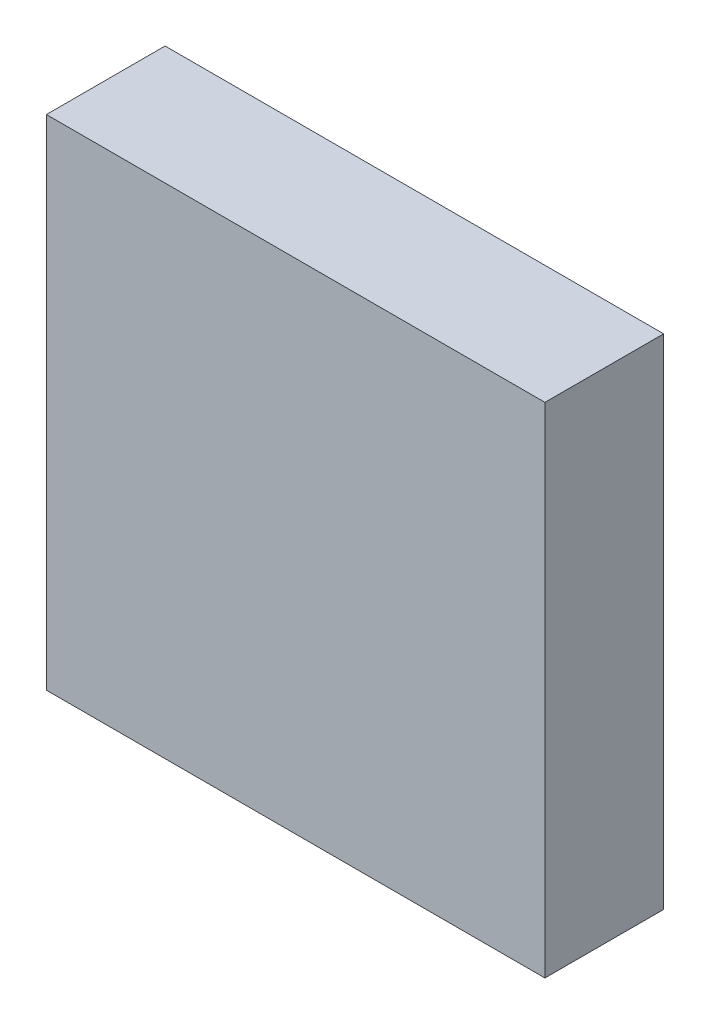
ISO-10303-21;
HEADER;
FILE_DESCRIPTION(('STEP AP214'),'2;1');
FILE_NAME('part.step','',(''),(''),'','','');
FILE_SCHEMA(('AUTOMOTIVE_DESIGN { 1 0 10303 214 1 1 1 1 }'));
ENDSEC;
DATA;
#1=APPLICATION_CONTEXT('core data for automotive mechanical design processes');
#2=APPLICATION_PROTOCOL_DEFINITION('international standard','automotive_design',2000,#1);
#3=PRODUCT_CONTEXT('',#1,'mechanical');
#4=PRODUCT('Part','Part','',(#3));
#5=PRODUCT_RELATED_PRODUCT_CATEGORY('part','',(#4));
#6=PRODUCT_DEFINITION_FORMATION('','',#4);
#7=PRODUCT_DEFINITION_CONTEXT('part definition',#1,'design');
#8=PRODUCT_DEFINITION('design','',#6,#7);
#9=PRODUCT_DEFINITION_SHAPE('','',#8);
#10=(LENGTH_UNIT() NAMED_UNIT(*) SI_UNIT(.MILLI.,.METRE.));
#11=(NAMED_UNIT(*) PLANE_ANGLE_UNIT() SI_UNIT($,.RADIAN.));
#12=(NAMED_UNIT(*) SI_UNIT($,.STERADIAN.) SOLID_ANGLE_UNIT());
#13=UNCERTAINTY_MEASURE_WITH_UNIT(LENGTH_MEASURE(1.E-05),#10,'distance_accuracy_value','');
#14=(GEOMETRIC_REPRESENTATION_CONTEXT(3) GLOBAL_UNCERTAINTY_ASSIGNED_CONTEXT((#13)) GLOBAL_UNIT_ASSIGNED_CONTEXT((#10,
#11,#12)) REPRESENTATION_CONTEXT('',''));
#15=CARTESIAN_POINT('',(0.,0.,0.));
#16=DIRECTION('',(0.,0.,1.));
#17=DIRECTION('',(1.,0.,0.));
#18=AXIS2_PLACEMENT_3D('',#15,#16,#17);
#19=CARTESIAN_POINT('',(1000.,1000.,500.));
#20=DIRECTION('',(-1.,0.,0.));
#21=DIRECTION('',(0.,-1.,0.));
#22=AXIS2_PLACEMENT_3D('',#19,#20,#21);
#23=PLANE('',#22);
#24=DIRECTION('',(0.,0.,-1.));
#25=VECTOR('',#24,1.);
#26=CARTESIAN_POINT('',(1000.,-1000.,500.));
#27=LINE('',#26,#25);
#28=CARTESIAN_POINT('',(1000.,-1000.,490.));
#29=VERTEX_POINT('',#28);
#30=CARTESIAN_POINT('',(1000.,-1000.,0.));
#31=VERTEX_POINT('',#30);
#32=EDGE_CURVE('E61',#29,#31,#27,.T.);
#33=ORIENTED_EDGE('',*,*,#32,.F.);
#34=DIRECTION('',(0.,1.,0.));
#35=VECTOR('',#34,1.);
#36=CARTESIAN_POINT('',(1000.,1000.,490.));
#37=LINE('',#36,#35);
#38=CARTESIAN_POINT('',(1000.,1000.,490.));
#39=VERTEX_POINT('',#38);
#40=EDGE_CURVE('E55',#29,#39,#37,.T.);
#41=ORIENTED_EDGE('',*,*,#40,.T.);
#42=DIRECTION('',(0.,0.,-1.));
#43=VECTOR('',#42,1.);
#44=CARTESIAN_POINT('',(1000.,1000.,500.));
#45=LINE('',#44,#43);
#46=CARTESIAN_POINT('',(1000.,1000.,0.));
#47=VERTEX_POINT('',#46);
#48=EDGE_CURVE('E124',#39,#47,#45,.T.);
#49=ORIENTED_EDGE('',*,*,#48,.T.);
#50=DIRECTION('',(0.,1.,0.));
#51=VECTOR('',#50,1.);
#52=CARTESIAN_POINT('',(1000.,1000.,0.));
#53=LINE('',#52,#51);
#54=EDGE_CURVE('E286',#31,#47,#53,.T.);
#55=ORIENTED_EDGE('',*,*,#54,.F.);
#56=EDGE_LOOP('',(#33,#41,#49,#55));
#57=FACE_BOUND('',#56,.T.);
#58=ADVANCED_FACE('F39',(#57),#23,.T.);
#59=CARTESIAN_POINT('',(-1000.,1000.,500.));
#60=DIRECTION('',(0.,-1.,0.));
#61=DIRECTION('',(0.,0.,-1.));
#62=AXIS2_PLACEMENT_3D('',#59,#60,#61);
#63=PLANE('',#62);
#64=ORIENTED_EDGE('',*,*,#48,.F.);
#65=DIRECTION('',(-1.,0.,0.));
#66=VECTOR('',#65,1.);
#67=CARTESIAN_POINT('',(-1000.,1000.,490.));
#68=LINE('',#67,#66);
#69=CARTESIAN_POINT('',(-1000.,1000.,490.));
#70=VERTEX_POINT('',#69);
#71=EDGE_CURVE('E114',#39,#70,#68,.T.);
#72=ORIENTED_EDGE('',*,*,#71,.T.);
#73=DIRECTION('',(0.,0.,-1.));
#74=VECTOR('',#73,1.);
#75=CARTESIAN_POINT('',(-1000.,1000.,500.));
#76=LINE('',#75,#74);
#77=CARTESIAN_POINT('',(-1000.,1000.,0.));
#78=VERTEX_POINT('',#77);
#79=EDGE_CURVE('E112',#70,#78,#76,.T.);
#80=ORIENTED_EDGE('',*,*,#79,.T.);
#81=DIRECTION('',(-1.,0.,0.));
#82=VECTOR('',#81,1.);
#83=CARTESIAN_POINT('',(-1000.,1000.,0.));
#84=LINE('',#83,#82);
#85=EDGE_CURVE('E290',#47,#78,#84,.T.);
#86=ORIENTED_EDGE('',*,*,#85,.F.);
#87=EDGE_LOOP('',(#64,#72,#80,#86));
#88=FACE_BOUND('',#87,.T.);
#89=ADVANCED_FACE('F204',(#88),#63,.T.);
#90=CARTESIAN_POINT('',(-1000.,1000.,500.));
#91=DIRECTION('',(1.,0.,0.));
#92=DIRECTION('',(0.,1.,0.));
#93=AXIS2_PLACEMENT_3D('',#90,#91,#92);
#94=PLANE('',#93);
#95=ORIENTED_EDGE('',*,*,#79,.F.);
#96=DIRECTION('',(0.,-1.,0.));
#97=VECTOR('',#96,1.);
#98=CARTESIAN_POINT('',(-1000.,1000.,490.));
#99=LINE('',#98,#97);
#100=CARTESIAN_POINT('',(-1000.,-1000.,490.));
#101=VERTEX_POINT('',#100);
#102=EDGE_CURVE('E104',#70,#101,#99,.T.);
#103=ORIENTED_EDGE('',*,*,#102,.T.);
#104=DIRECTION('',(0.,0.,-1.));
#105=VECTOR('',#104,1.);
#106=CARTESIAN_POINT('',(-1000.,-1000.,500.));
#107=LINE('',#106,#105);
#108=CARTESIAN_POINT('',(-1000.,-1000.,0.));
#109=VERTEX_POINT('',#108);
#110=EDGE_CURVE('E111',#101,#109,#107,.T.);
#111=ORIENTED_EDGE('',*,*,#110,.T.);
#112=DIRECTION('',(0.,-1.,0.));
#113=VECTOR('',#112,1.);
#114=CARTESIAN_POINT('',(-1000.,1000.,0.));
#115=LINE('',#114,#113);
#116=EDGE_CURVE('E292',#78,#109,#115,.T.);
#117=ORIENTED_EDGE('',*,*,#116,.F.);
#118=EDGE_LOOP('',(#95,#103,#111,#117));
#119=FACE_BOUND('',#118,.T.);
#120=ADVANCED_FACE('F109',(#119),#94,.T.);
#121=CARTESIAN_POINT('',(-1000.,-1000.,500.));
#122=DIRECTION('',(0.,1.,0.));
#123=DIRECTION('',(0.,0.,1.));
#124=AXIS2_PLACEMENT_3D('',#121,#122,#123);
#125=PLANE('',#124);
#126=ORIENTED_EDGE('',*,*,#110,.F.);
#127=DIRECTION('',(1.,0.,0.));
#128=VECTOR('',#127,1.);
#129=CARTESIAN_POINT('',(-1000.,-1000.,490.));
#130=LINE('',#129,#128);
#131=EDGE_CURVE('E11',#101,#29,#130,.T.);
#132=ORIENTED_EDGE('',*,*,#131,.T.);
#133=ORIENTED_EDGE('',*,*,#32,.T.);
#134=DIRECTION('',(1.,0.,0.));
#135=VECTOR('',#134,1.);
#136=CARTESIAN_POINT('',(-1000.,-1000.,0.));
#137=LINE('',#136,#135);
#138=EDGE_CURVE('E118',#109,#31,#137,.T.);
#139=ORIENTED_EDGE('',*,*,#138,.F.);
#140=EDGE_LOOP('',(#126,#132,#133,#139));
#141=FACE_BOUND('',#140,.T.);
#142=ADVANCED_FACE('F116',(#141),#125,.T.);
#143=CARTESIAN_POINT('',(0.,0.,500.));
#144=DIRECTION('',(0.,0.,1.));
#145=DIRECTION('',(1.,0.,0.));
#146=AXIS2_PLACEMENT_3D('',#143,#144,#145);
#147=PLANE('',#146);
#148=DIRECTION('',(0.,1.,0.));
#149=VECTOR('',#148,1.);
#150=CARTESIAN_POINT('',(1050.,1050.,500.));
#151=LINE('',#150,#149);
#152=CARTESIAN_POINT('',(1050.,-1050.,500.));
#153=VERTEX_POINT('',#152);
#154=CARTESIAN_POINT('',(1050.,1050.,500.));
#155=VERTEX_POINT('',#154);
#156=EDGE_CURVE('E132',#153,#155,#151,.T.);
#157=ORIENTED_EDGE('',*,*,#156,.T.);
#158=DIRECTION('',(-1.,0.,0.));
#159=VECTOR('',#158,1.);
#160=CARTESIAN_POINT('',(-1050.,1050.,500.));
#161=LINE('',#160,#159);
#162=CARTESIAN_POINT('',(-1050.,1050.,500.));
#163=VERTEX_POINT('',#162);
#164=EDGE_CURVE('E136',#155,#163,#161,.T.);
#165=ORIENTED_EDGE('',*,*,#164,.T.);
#166=DIRECTION('',(0.,-1.,0.));
#167=VECTOR('',#166,1.);
#168=CARTESIAN_POINT('',(-1050.,1050.,500.));
#169=LINE('',#168,#167);
#170=CARTESIAN_POINT('',(-1050.,-1050.,500.));
#171=VERTEX_POINT('',#170);
#172=EDGE_CURVE('E140',#163,#171,#169,.T.);
#173=ORIENTED_EDGE('',*,*,#172,.T.);
#174=DIRECTION('',(1.,0.,0.));
#175=VECTOR('',#174,1.);
#176=CARTESIAN_POINT('',(-1050.,-1050.,500.));
#177=LINE('',#176,#175);
#178=EDGE_CURVE('E143',#171,#153,#177,.T.);
#179=ORIENTED_EDGE('',*,*,#178,.T.);
#180=EDGE_LOOP('',(#157,#165,#173,#179));
#181=FACE_BOUND('',#180,.T.);
#182=ADVANCED_FACE('F191',(#181),#147,.T.);
#183=CARTESIAN_POINT('',(0.,0.,0.));
#184=DIRECTION('',(0.,0.,1.));
#185=DIRECTION('',(1.,0.,0.));
#186=AXIS2_PLACEMENT_3D('',#183,#184,#185);
#187=PLANE('',#186);
#188=DIRECTION('',(0.,1.,0.));
#189=VECTOR('',#188,1.);
#190=CARTESIAN_POINT('',(1050.,1050.,0.));
#191=LINE('',#190,#189);
#192=CARTESIAN_POINT('',(1050.,-1050.,0.));
#193=VERTEX_POINT('',#192);
#194=CARTESIAN_POINT('',(1050.,1050.,0.));
#195=VERTEX_POINT('',#194);
#196=EDGE_CURVE('E131',#193,#195,#191,.T.);
#197=ORIENTED_EDGE('',*,*,#196,.F.);
#198=DIRECTION('',(1.,0.,0.));
#199=VECTOR('',#198,1.);
#200=CARTESIAN_POINT('',(-1050.,-1050.,0.));
#201=LINE('',#200,#199);
#202=CARTESIAN_POINT('',(-1050.,-1050.,0.));
#203=VERTEX_POINT('',#202);
#204=EDGE_CURVE('E137',#203,#193,#201,.T.);
#205=ORIENTED_EDGE('',*,*,#204,.F.);
#206=DIRECTION('',(0.,-1.,0.));
#207=VECTOR('',#206,1.);
#208=CARTESIAN_POINT('',(-1050.,1050.,0.));
#209=LINE('',#208,#207);
#210=CARTESIAN_POINT('',(-1050.,1050.,0.));
#211=VERTEX_POINT('',#210);
#212=EDGE_CURVE('E154',#211,#203,#209,.T.);
#213=ORIENTED_EDGE('',*,*,#212,.F.);
#214=DIRECTION('',(-1.,0.,0.));
#215=VECTOR('',#214,1.);
#216=CARTESIAN_POINT('',(-1050.,1050.,0.));
#217=LINE('',#216,#215);
#218=EDGE_CURVE('E150',#195,#211,#217,.T.);
#219=ORIENTED_EDGE('',*,*,#218,.F.);
#220=EDGE_LOOP('',(#197,#205,#213,#219));
#221=FACE_BOUND('',#220,.T.);
#222=ORIENTED_EDGE('',*,*,#54,.T.);
#223=ORIENTED_EDGE('',*,*,#85,.T.);
#224=ORIENTED_EDGE('',*,*,#116,.T.);
#225=ORIENTED_EDGE('',*,*,#138,.T.);
#226=EDGE_LOOP('',(#222,#223,#224,#225));
#227=FACE_BOUND('',#226,.T.);
#228=ADVANCED_FACE('F179',(#221,#227),#187,.F.);
#229=CARTESIAN_POINT('',(1050.,1050.,500.));
#230=DIRECTION('',(-1.,0.,0.));
#231=DIRECTION('',(0.,-1.,0.));
#232=AXIS2_PLACEMENT_3D('',#229,#230,#231);
#233=PLANE('',#232);
#234=DIRECTION('',(0.,0.,-1.));
#235=VECTOR('',#234,1.);
#236=CARTESIAN_POINT('',(1050.,-1050.,500.));
#237=LINE('',#236,#235);
#238=EDGE_CURVE('E146',#153,#193,#237,.T.);
#239=ORIENTED_EDGE('',*,*,#238,.T.);
#240=ORIENTED_EDGE('',*,*,#196,.T.);
#241=DIRECTION('',(0.,0.,-1.));
#242=VECTOR('',#241,1.);
#243=CARTESIAN_POINT('',(1050.,1050.,500.));
#244=LINE('',#243,#242);
#245=EDGE_CURVE('E48',#155,#195,#244,.T.);
#246=ORIENTED_EDGE('',*,*,#245,.F.);
#247=ORIENTED_EDGE('',*,*,#156,.F.);
#248=EDGE_LOOP('',(#239,#240,#246,#247));
#249=FACE_BOUND('',#248,.T.);
#250=ADVANCED_FACE('F41',(#249),#233,.F.);
#251=CARTESIAN_POINT('',(-1050.,1050.,500.));
#252=DIRECTION('',(0.,-1.,0.));
#253=DIRECTION('',(0.,0.,-1.));
#254=AXIS2_PLACEMENT_3D('',#251,#252,#253);
#255=PLANE('',#254);
#256=ORIENTED_EDGE('',*,*,#245,.T.);
#257=ORIENTED_EDGE('',*,*,#218,.T.);
#258=DIRECTION('',(0.,0.,-1.));
#259=VECTOR('',#258,1.);
#260=CARTESIAN_POINT('',(-1050.,1050.,500.));
#261=LINE('',#260,#259);
#262=EDGE_CURVE('E166',#163,#211,#261,.T.);
#263=ORIENTED_EDGE('',*,*,#262,.F.);
#264=ORIENTED_EDGE('',*,*,#164,.F.);
#265=EDGE_LOOP('',(#256,#257,#263,#264));
#266=FACE_BOUND('',#265,.T.);
#267=ADVANCED_FACE('F172',(#266),#255,.F.);
#268=CARTESIAN_POINT('',(-1050.,1050.,500.));
#269=DIRECTION('',(1.,0.,0.));
#270=DIRECTION('',(0.,1.,0.));
#271=AXIS2_PLACEMENT_3D('',#268,#269,#270);
#272=PLANE('',#271);
#273=ORIENTED_EDGE('',*,*,#262,.T.);
#274=ORIENTED_EDGE('',*,*,#212,.T.);
#275=DIRECTION('',(0.,0.,-1.));
#276=VECTOR('',#275,1.);
#277=CARTESIAN_POINT('',(-1050.,-1050.,500.));
#278=LINE('',#277,#276);
#279=EDGE_CURVE('E163',#171,#203,#278,.T.);
#280=ORIENTED_EDGE('',*,*,#279,.F.);
#281=ORIENTED_EDGE('',*,*,#172,.F.);
#282=EDGE_LOOP('',(#273,#274,#280,#281));
#283=FACE_BOUND('',#282,.T.);
#284=ADVANCED_FACE('F189',(#283),#272,.F.);
#285=CARTESIAN_POINT('',(-1050.,-1050.,500.));
#286=DIRECTION('',(0.,1.,0.));
#287=DIRECTION('',(0.,0.,1.));
#288=AXIS2_PLACEMENT_3D('',#285,#286,#287);
#289=PLANE('',#288);
#290=ORIENTED_EDGE('',*,*,#279,.T.);
#291=ORIENTED_EDGE('',*,*,#204,.T.);
#292=ORIENTED_EDGE('',*,*,#238,.F.);
#293=ORIENTED_EDGE('',*,*,#178,.F.);
#294=EDGE_LOOP('',(#290,#291,#292,#293));
#295=FACE_BOUND('',#294,.T.);
#296=ADVANCED_FACE('F185',(#295),#289,.F.);
#297=CARTESIAN_POINT('',(0.,0.,490.));
#298=DIRECTION('',(0.,0.,1.));
#299=DIRECTION('',(1.,0.,0.));
#300=AXIS2_PLACEMENT_3D('',#297,#298,#299);
#301=PLANE('',#300);
#302=ORIENTED_EDGE('',*,*,#40,.F.);
#303=ORIENTED_EDGE('',*,*,#131,.F.);
#304=ORIENTED_EDGE('',*,*,#102,.F.);
#305=ORIENTED_EDGE('',*,*,#71,.F.);
#306=EDGE_LOOP('',(#302,#303,#304,#305));
#307=FACE_BOUND('',#306,.T.);
#308=ADVANCED_FACE('F103',(#307),#301,.F.);
#309=CLOSED_SHELL('',(#58,#89,#120,#142,#182,#228,#250,#267,#284,#296,#308));
#310=MANIFOLD_SOLID_BREP('B2',#309);
#311=ADVANCED_BREP_SHAPE_REPRESENTATION('',(#18,#310),#14);
#312=SHAPE_DEFINITION_REPRESENTATION(#9,#311);
ENDSEC;
END-ISO-10303-21;
